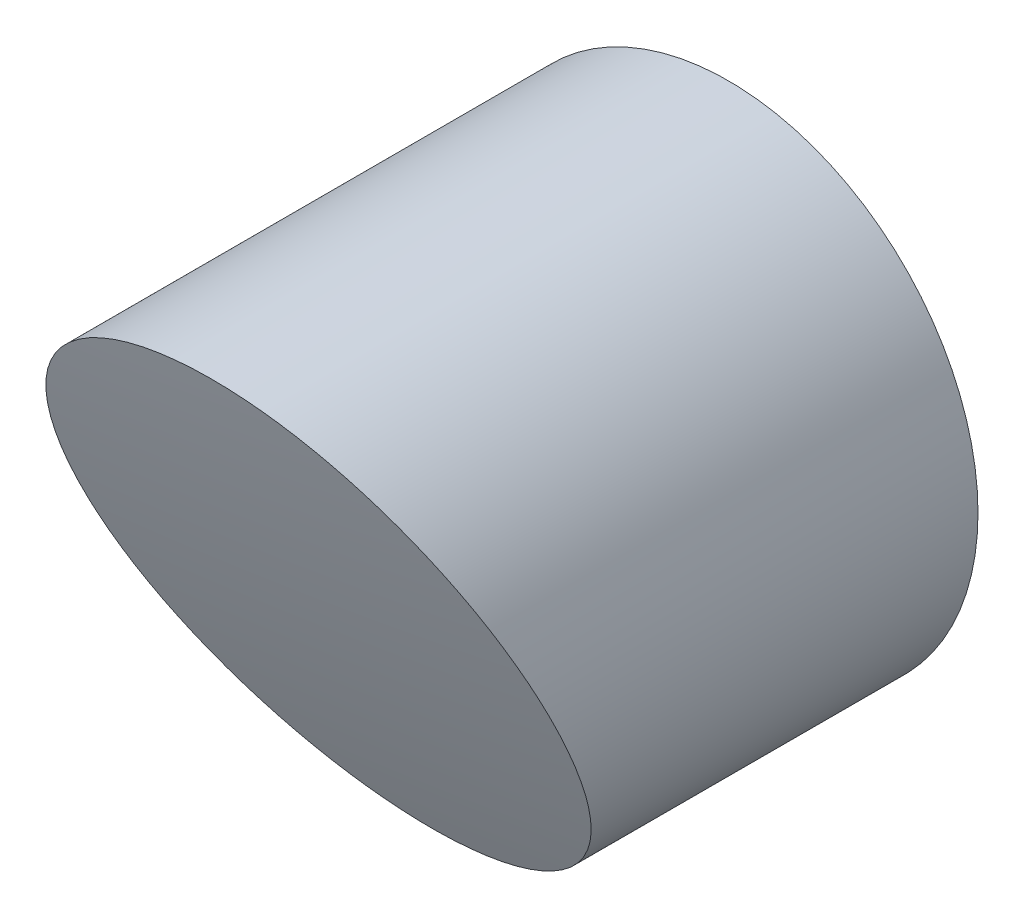
ISO-10303-21;
HEADER;
FILE_DESCRIPTION(('STEP AP214'),'2;1');
FILE_NAME('part.step','',(''),(''),'','','');
FILE_SCHEMA(('AUTOMOTIVE_DESIGN { 1 0 10303 214 1 1 1 1 }'));
ENDSEC;
DATA;
#1=APPLICATION_CONTEXT('core data for automotive mechanical design processes');
#2=APPLICATION_PROTOCOL_DEFINITION('international standard','automotive_design',2000,#1);
#3=PRODUCT_CONTEXT('',#1,'mechanical');
#4=PRODUCT('Part','Part','',(#3));
#5=PRODUCT_RELATED_PRODUCT_CATEGORY('part','',(#4));
#6=PRODUCT_DEFINITION_FORMATION('','',#4);
#7=PRODUCT_DEFINITION_CONTEXT('part definition',#1,'design');
#8=PRODUCT_DEFINITION('design','',#6,#7);
#9=PRODUCT_DEFINITION_SHAPE('','',#8);
#10=(LENGTH_UNIT() NAMED_UNIT(*) SI_UNIT(.MILLI.,.METRE.));
#11=(NAMED_UNIT(*) PLANE_ANGLE_UNIT() SI_UNIT($,.RADIAN.));
#12=(NAMED_UNIT(*) SI_UNIT($,.STERADIAN.) SOLID_ANGLE_UNIT());
#13=UNCERTAINTY_MEASURE_WITH_UNIT(LENGTH_MEASURE(1.E-05),#10,'distance_accuracy_value','');
#14=(GEOMETRIC_REPRESENTATION_CONTEXT(3) GLOBAL_UNCERTAINTY_ASSIGNED_CONTEXT((#13)) GLOBAL_UNIT_ASSIGNED_CONTEXT((#10,
#11,#12)) REPRESENTATION_CONTEXT('',''));
#15=CARTESIAN_POINT('',(0.,0.,0.));
#16=DIRECTION('',(0.,0.,1.));
#17=DIRECTION('',(1.,0.,0.));
#18=AXIS2_PLACEMENT_3D('',#15,#16,#17);
#19=CARTESIAN_POINT('',(0.,-13.3333333333333,50.101));
#20=DIRECTION('',(0.,0.,-1.));
#21=DIRECTION('',(-1.,0.,0.));
#22=AXIS2_PLACEMENT_3D('',#19,#20,#21);
#23=CYLINDRICAL_SURFACE('',#22,1.95);
#24=CARTESIAN_POINT('',(-1.94999999999999,-13.3333333333333,47.2094966059181));
#25=CARTESIAN_POINT('',(-1.94999654811926,-13.4517186096544,47.1573101021188));
#26=CARTESIAN_POINT('',(-1.93919822630933,-13.5700751632394,47.104797370715));
#27=CARTESIAN_POINT('',(-1.89621878947342,-13.8033986837615,47.000619953166));
#28=CARTESIAN_POINT('',(-1.8640050267195,-13.9183601950676,46.9489566854413));
#29=CARTESIAN_POINT('',(-1.77862455203547,-14.1415938628184,46.8480395487134));
#30=CARTESIAN_POINT('',(-1.72543281319293,-14.2498578499268,46.7987886368605));
#31=CARTESIAN_POINT('',(-1.59897485819752,-14.4560031782805,46.7045050564509));
#32=CARTESIAN_POINT('',(-1.5257180959314,-14.5538893790975,46.6594704147208));
#33=CARTESIAN_POINT('',(-1.36420127020003,-14.7316310370921,46.577319845245));
#34=CARTESIAN_POINT('',(-1.27673936222097,-14.8120886604188,46.5399433865185));
#35=CARTESIAN_POINT('',(-1.08682015277236,-14.9567685955796,46.4724954420563));
#36=CARTESIAN_POINT('',(-0.984372514131139,-15.0210012970411,46.4424192820596));
#37=CARTESIAN_POINT('',(-0.777731739233523,-15.1249061193767,46.3936470520437));
#38=CARTESIAN_POINT('',(-0.674602183268373,-15.1663159633751,46.374148571047));
#39=CARTESIAN_POINT('',(-0.461665159810001,-15.2311544445799,46.3435792069737));
#40=CARTESIAN_POINT('',(-0.351862239188078,-15.2545951799668,46.332502653651));
#41=CARTESIAN_POINT('',(-0.139047005216508,-15.2810637252516,46.3199921353474));
#42=CARTESIAN_POINT('',(-0.0362749364283789,-15.2856899426806,46.3178031480409));
#43=CARTESIAN_POINT('',(0.168581703789448,-15.2787318372093,46.3210935697225));
#44=CARTESIAN_POINT('',(0.270666426515146,-15.2671512072662,46.3265712317572));
#45=CARTESIAN_POINT('',(0.468009232095503,-15.2289237252827,46.3446259918155));
#46=CARTESIAN_POINT('',(0.563380702149392,-15.2027509807662,46.3569796635148));
#47=CARTESIAN_POINT('',(0.748163645801881,-15.1367689942028,46.3880560569821));
#48=CARTESIAN_POINT('',(0.837574464839495,-15.0969582574548,46.4067794768623));
#49=CARTESIAN_POINT('',(1.01152785004217,-15.0034866609646,46.4506160358255));
#50=CARTESIAN_POINT('',(1.09577458918879,-14.9493742534136,46.4759370221946));
#51=CARTESIAN_POINT('',(1.25399599151732,-14.8299405183405,46.5316261684947));
#52=CARTESIAN_POINT('',(1.32796745400994,-14.7646157123238,46.5619958946365));
#53=CARTESIAN_POINT('',(1.47000398649317,-14.6189273599951,46.6294523958254));
#54=CARTESIAN_POINT('',(1.53709732527693,-14.5377722990259,46.6668847908695));
#55=CARTESIAN_POINT('',(1.62682060327881,-14.4097535049299,46.7256465425368));
#56=CARTESIAN_POINT('',(1.65491700378146,-14.3660160995138,46.7456769538142));
#57=CARTESIAN_POINT('',(1.70742684125099,-14.276667740127,46.7864953363713));
#58=CARTESIAN_POINT('',(1.73183738312202,-14.2310553488357,46.8072838873924));
#59=CARTESIAN_POINT('',(1.80343535304468,-14.0835000713941,46.8743620017114));
#60=CARTESIAN_POINT('',(1.84353875830659,-13.9785559297027,46.9218160485174));
#61=CARTESIAN_POINT('',(1.90512391315846,-13.7639955734824,47.0182580585171));
#62=CARTESIAN_POINT('',(1.92659825188028,-13.6543775177903,47.067246624139));
#63=CARTESIAN_POINT('',(1.94498789960814,-13.4850684918903,47.1424530072658));
#64=CARTESIAN_POINT('',(1.94869302200177,-13.4260157083249,47.1686000202887));
#65=CARTESIAN_POINT('',(1.95072833580817,-13.3078303749746,47.2207614336281));
#66=CARTESIAN_POINT('',(1.94906363882253,-13.2486979545761,47.2467759364643));
#67=CARTESIAN_POINT('',(1.93597718972684,-13.0716457669584,47.3244163789663));
#68=CARTESIAN_POINT('',(1.91646598097835,-12.9540442398601,47.3756511710448));
#69=CARTESIAN_POINT('',(1.85573692989062,-12.7224272960616,47.4759317789517));
#70=CARTESIAN_POINT('',(1.81434209791069,-12.608449272228,47.5249561566272));
#71=CARTESIAN_POINT('',(1.71027213632595,-12.3887580484051,47.6188992577726));
#72=CARTESIAN_POINT('',(1.64760156785324,-12.2830430829371,47.6638188586147));
#73=CARTESIAN_POINT('',(1.50570862948769,-12.0887008795074,47.7459693986482));
#74=CARTESIAN_POINT('',(1.42743883228934,-11.9994928334718,47.7834679275348));
#75=CARTESIAN_POINT('',(1.25448328391051,-11.8356912203097,47.8520357258889));
#76=CARTESIAN_POINT('',(1.1598065263838,-11.7610896939297,47.8831084973441));
#77=CARTESIAN_POINT('',(0.964918750129241,-11.6351587477359,47.9353944134479));
#78=CARTESIAN_POINT('',(0.865763492313512,-11.582441138707,47.95719913156));
#79=CARTESIAN_POINT('',(0.658728902272812,-11.4945287498808,47.9934891471975));
#80=CARTESIAN_POINT('',(0.550854175868277,-11.45932478839,48.0079782800464));
#81=CARTESIAN_POINT('',(0.338024230441756,-11.4099792630826,48.0282691691045));
#82=CARTESIAN_POINT('',(0.233434849462038,-11.3944826779919,48.0346299830733));
#83=CARTESIAN_POINT('',(0.022947411862098,-11.3806202746571,48.0403205619932));
#84=CARTESIAN_POINT('',(-0.0829502937286841,-11.3822499569474,48.0396521736778));
#85=CARTESIAN_POINT('',(-0.289042483594653,-11.4021963078211,48.0314626267423));
#86=CARTESIAN_POINT('',(-0.389305508108658,-11.4199142795278,48.0241873311937));
#87=CARTESIAN_POINT('',(-0.585239261528592,-11.470476113867,48.0033874146067));
#88=CARTESIAN_POINT('',(-0.680909958550266,-11.5033200815017,47.9898627501863));
#89=CARTESIAN_POINT('',(-0.866327669678698,-11.5833945004148,47.9568026088103));
#90=CARTESIAN_POINT('',(-0.955990746636591,-11.6307913295633,47.9371975896048));
#91=CARTESIAN_POINT('',(-1.08340522050625,-11.7112153253217,47.9038197190132));
#92=CARTESIAN_POINT('',(-1.12470724776321,-11.7395873564783,47.8920281850445));
#93=CARTESIAN_POINT('',(-1.20480471904192,-11.7992407599215,47.8671930149396));
#94=CARTESIAN_POINT('',(-1.24359833894258,-11.8305242099565,47.8541484843794));
#95=CARTESIAN_POINT('',(-1.35972511111912,-11.9317170239514,47.8118736048497));
#96=CARTESIAN_POINT('',(-1.43242697932318,-12.0062073889819,47.7806453317921));
#97=CARTESIAN_POINT('',(-1.56436560771611,-12.1646158923464,47.7139249805906));
#98=CARTESIAN_POINT('',(-1.62359508981311,-12.2485390901103,47.678430613554));
#99=CARTESIAN_POINT('',(-1.70363621559245,-12.3830035327995,47.6212730202674));
#100=CARTESIAN_POINT('',(-1.72956106144118,-12.4310715109436,47.6007884912519));
#101=CARTESIAN_POINT('',(-1.77715468357434,-12.5288600611711,47.5590011615618));
#102=CARTESIAN_POINT('',(-1.79882723871321,-12.578579119628,47.5376991077072));
#103=CARTESIAN_POINT('',(-1.85736990114658,-12.7297376196516,47.472752159396));
#104=CARTESIAN_POINT('',(-1.88783107453212,-12.8332903190815,47.4280189516627));
#105=CARTESIAN_POINT('',(-1.92303276335808,-13.0033499318316,47.3541238704476));
#106=CARTESIAN_POINT('',(-1.93314452187997,-13.0690448754111,47.3254762106638));
#107=CARTESIAN_POINT('',(-1.94662919129517,-13.2009406415973,47.2677519047079));
#108=CARTESIAN_POINT('',(-1.95000193002373,-13.2671414770849,47.238675247595));
#109=CARTESIAN_POINT('',(-1.94999999999999,-13.3333333333333,47.2094966059181));
#110=B_SPLINE_CURVE_WITH_KNOTS('',3,(#24,#25,#26,#27,#28,#29,#30,#31,#32,#33,#34,#35,#36,#37,
#38,#39,#40,#41,#42,#43,#44,#45,#46,#47,#48,#49,#50,#51,#52,#53,#54,#55,#56,#57,#58,#59,#60,#61,
#62,#63,#64,#65,#66,#67,#68,#69,#70,#71,#72,#73,#74,#75,#76,#77,#78,#79,#80,#81,#82,#83,#84,#85,
#86,#87,#88,#89,#90,#91,#92,#93,#94,#95,#96,#97,#98,#99,#100,#101,#102,#103,#104,#105,#106,#107,
#108,#109),.UNSPECIFIED.,.T.,.F.,(4,2,2,2,2,2,2,2,2,2,2,2,2,2,2,2,2,2,2,2,2,2,2,2,2,2,2,2,2,2,2,
2,2,2,2,2,2,2,2,2,2,2,4),(0.,0.387869602781304,0.776331870890678,1.16525898669745,
1.55400316891949,1.92571178721849,2.29718177505407,2.63383494057568,2.97026124583382,
3.27742039982114,3.58450957468969,3.8821582684099,4.17983959436817,4.48836062415901,
4.79697754199084,5.13072995467464,5.29772569283326,5.46485192472688,5.82905033479368,
6.19339356104396,6.38725821096157,6.58093837305152,6.96821127859544,7.35866538448332,
7.74903583689567,8.12043204813721,8.49162531478634,8.83299609570817,9.17418772070693,
9.49036367957116,9.80645657379394,10.1112481259636,10.416041793977,10.724458692551,
10.8787534674838,11.0331592126023,11.3576895771676,11.6823948462803,11.8572126451015,
12.0318743790487,12.3807871303062,12.5976481616195,12.8145147331075),.UNSPECIFIED.);
#111=CARTESIAN_POINT('',(-1.94999999999999,-13.3333333333333,47.2094966059181));
#112=VERTEX_POINT('',#111);
#113=EDGE_CURVE('E10',#112,#112,#110,.T.);
#114=ORIENTED_EDGE('',*,*,#113,.F.);
#115=EDGE_LOOP('',(#114));
#116=FACE_BOUND('',#115,.T.);
#117=CARTESIAN_POINT('',(0.,-13.3333333333333,44.));
#118=DIRECTION('',(0.,0.,1.));
#119=DIRECTION('',(1.,0.,0.));
#120=AXIS2_PLACEMENT_3D('',#117,#118,#119);
#121=CIRCLE('',#120,1.95);
#122=CARTESIAN_POINT('',(1.95,-13.3333333333333,44.));
#123=VERTEX_POINT('',#122);
#124=EDGE_CURVE('E46',#123,#123,#121,.T.);
#125=ORIENTED_EDGE('',*,*,#124,.T.);
#126=EDGE_LOOP('',(#125));
#127=FACE_BOUND('',#126,.T.);
#128=ADVANCED_FACE('F37',(#116,#127),#23,.T.);
#129=CARTESIAN_POINT('',(0.,0.,0.));
#130=DIRECTION('',(0.,0.,1.));
#131=DIRECTION('',(-1.,0.,0.));
#132=AXIS2_PLACEMENT_3D('',#129,#130,#131);
#133=ELLIPSE('',#132,50.,40.);
#134=TRIMMED_CURVE('',#133,(PARAMETER_VALUE(1.5707963267949)),
(PARAMETER_VALUE(4.71238898038469)),.T.,.PARAMETER.);
#135=CARTESIAN_POINT('',(0.,0.,0.));
#136=DIRECTION('',(0.,1.,0.));
#137=AXIS1_PLACEMENT('',#135,#136);
#138=SURFACE_OF_REVOLUTION('',#134,#137);
#139=OFFSET_SURFACE('',#138,0.1,.F.);
#140=ORIENTED_EDGE('',*,*,#113,.T.);
#141=EDGE_LOOP('',(#140));
#142=FACE_BOUND('',#141,.T.);
#143=ADVANCED_FACE('F56',(#142),#139,.T.);
#144=CARTESIAN_POINT('',(0.,-13.3333333333333,44.));
#145=DIRECTION('',(0.,0.,1.));
#146=DIRECTION('',(1.,0.,0.));
#147=AXIS2_PLACEMENT_3D('',#144,#145,#146);
#148=PLANE('',#147);
#149=ORIENTED_EDGE('',*,*,#124,.F.);
#150=EDGE_LOOP('',(#149));
#151=FACE_BOUND('',#150,.T.);
#152=ADVANCED_FACE('F60',(#151),#148,.F.);
#153=CLOSED_SHELL('',(#128,#143,#152));
#154=MANIFOLD_SOLID_BREP('B2',#153);
#155=ADVANCED_BREP_SHAPE_REPRESENTATION('',(#18,#154),#14);
#156=SHAPE_DEFINITION_REPRESENTATION(#9,#155);
ENDSEC;
END-ISO-10303-21;
